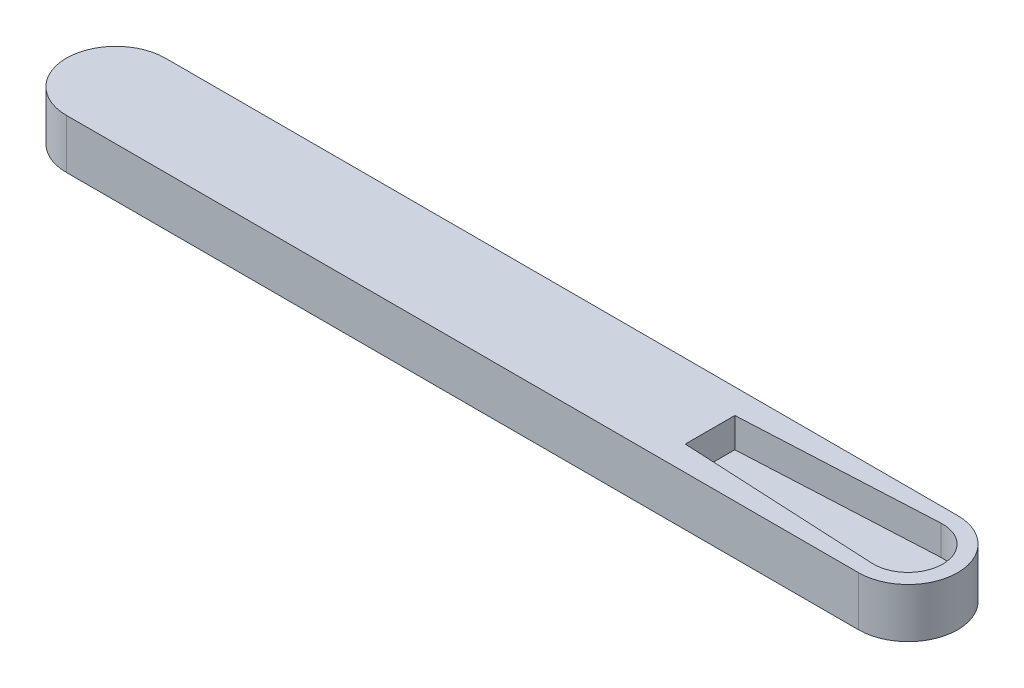
ISO-10303-21;
HEADER;
FILE_DESCRIPTION(('STEP AP214'),'2;1');
FILE_NAME('part.step','',(''),(''),'','','');
FILE_SCHEMA(('AUTOMOTIVE_DESIGN { 1 0 10303 214 1 1 1 1 }'));
ENDSEC;
DATA;
#1=APPLICATION_CONTEXT('core data for automotive mechanical design processes');
#2=APPLICATION_PROTOCOL_DEFINITION('international standard','automotive_design',2000,#1);
#3=PRODUCT_CONTEXT('',#1,'mechanical');
#4=PRODUCT('Part','Part','',(#3));
#5=PRODUCT_RELATED_PRODUCT_CATEGORY('part','',(#4));
#6=PRODUCT_DEFINITION_FORMATION('','',#4);
#7=PRODUCT_DEFINITION_CONTEXT('part definition',#1,'design');
#8=PRODUCT_DEFINITION('design','',#6,#7);
#9=PRODUCT_DEFINITION_SHAPE('','',#8);
#10=(LENGTH_UNIT() NAMED_UNIT(*) SI_UNIT(.MILLI.,.METRE.));
#11=(NAMED_UNIT(*) PLANE_ANGLE_UNIT() SI_UNIT($,.RADIAN.));
#12=(NAMED_UNIT(*) SI_UNIT($,.STERADIAN.) SOLID_ANGLE_UNIT());
#13=UNCERTAINTY_MEASURE_WITH_UNIT(LENGTH_MEASURE(1.E-05),#10,'distance_accuracy_value','');
#14=(GEOMETRIC_REPRESENTATION_CONTEXT(3) GLOBAL_UNCERTAINTY_ASSIGNED_CONTEXT((#13)) GLOBAL_UNIT_ASSIGNED_CONTEXT((#10,
#11,#12)) REPRESENTATION_CONTEXT('',''));
#15=CARTESIAN_POINT('',(0.,0.,0.));
#16=DIRECTION('',(0.,0.,1.));
#17=DIRECTION('',(1.,0.,0.));
#18=AXIS2_PLACEMENT_3D('',#15,#16,#17);
#19=CARTESIAN_POINT('',(0.,5.,5.));
#20=DIRECTION('',(0.,0.,-1.));
#21=DIRECTION('',(-1.,0.,0.));
#22=AXIS2_PLACEMENT_3D('',#19,#20,#21);
#23=PLANE('',#22);
#24=DIRECTION('',(1.,0.,0.));
#25=VECTOR('',#24,1.);
#26=CARTESIAN_POINT('',(0.,0.,5.));
#27=LINE('',#26,#25);
#28=CARTESIAN_POINT('',(0.,0.,5.));
#29=VERTEX_POINT('',#28);
#30=CARTESIAN_POINT('',(80.,0.,5.));
#31=VERTEX_POINT('',#30);
#32=EDGE_CURVE('E125',#29,#31,#27,.T.);
#33=ORIENTED_EDGE('',*,*,#32,.T.);
#34=DIRECTION('',(0.,-1.,0.));
#35=VECTOR('',#34,1.);
#36=CARTESIAN_POINT('',(80.,5.,5.));
#37=LINE('',#36,#35);
#38=CARTESIAN_POINT('',(80.,5.,5.));
#39=VERTEX_POINT('',#38);
#40=EDGE_CURVE('E11',#39,#31,#37,.T.);
#41=ORIENTED_EDGE('',*,*,#40,.F.);
#42=DIRECTION('',(1.,0.,0.));
#43=VECTOR('',#42,1.);
#44=CARTESIAN_POINT('',(0.,5.,5.));
#45=LINE('',#44,#43);
#46=CARTESIAN_POINT('',(0.,5.,5.));
#47=VERTEX_POINT('',#46);
#48=EDGE_CURVE('E136',#47,#39,#45,.T.);
#49=ORIENTED_EDGE('',*,*,#48,.F.);
#50=DIRECTION('',(0.,-1.,0.));
#51=VECTOR('',#50,1.);
#52=CARTESIAN_POINT('',(0.,5.,5.));
#53=LINE('',#52,#51);
#54=EDGE_CURVE('E155',#47,#29,#53,.T.);
#55=ORIENTED_EDGE('',*,*,#54,.T.);
#56=EDGE_LOOP('',(#33,#41,#49,#55));
#57=FACE_BOUND('',#56,.T.);
#58=ADVANCED_FACE('F35',(#57),#23,.F.);
#59=CARTESIAN_POINT('',(80.,5.,0.));
#60=DIRECTION('',(0.,-1.,0.));
#61=DIRECTION('',(0.,0.,-1.));
#62=AXIS2_PLACEMENT_3D('',#59,#60,#61);
#63=CYLINDRICAL_SURFACE('',#62,5.);
#64=CARTESIAN_POINT('',(80.,0.,0.));
#65=DIRECTION('',(0.,1.,0.));
#66=DIRECTION('',(0.,0.,1.));
#67=AXIS2_PLACEMENT_3D('',#64,#65,#66);
#68=CIRCLE('',#67,5.);
#69=CARTESIAN_POINT('',(80.,0.,-5.));
#70=VERTEX_POINT('',#69);
#71=EDGE_CURVE('E148',#31,#70,#68,.T.);
#72=ORIENTED_EDGE('',*,*,#71,.T.);
#73=DIRECTION('',(0.,-1.,0.));
#74=VECTOR('',#73,1.);
#75=CARTESIAN_POINT('',(80.,5.,-5.));
#76=LINE('',#75,#74);
#77=CARTESIAN_POINT('',(80.,5.,-5.));
#78=VERTEX_POINT('',#77);
#79=EDGE_CURVE('E44',#78,#70,#76,.T.);
#80=ORIENTED_EDGE('',*,*,#79,.F.);
#81=CARTESIAN_POINT('',(80.,5.,0.));
#82=DIRECTION('',(0.,1.,0.));
#83=DIRECTION('',(0.,0.,1.));
#84=AXIS2_PLACEMENT_3D('',#81,#82,#83);
#85=CIRCLE('',#84,5.);
#86=EDGE_CURVE('E139',#39,#78,#85,.T.);
#87=ORIENTED_EDGE('',*,*,#86,.F.);
#88=ORIENTED_EDGE('',*,*,#40,.T.);
#89=EDGE_LOOP('',(#72,#80,#87,#88));
#90=FACE_BOUND('',#89,.T.);
#91=ADVANCED_FACE('F180',(#90),#63,.T.);
#92=CARTESIAN_POINT('',(0.,5.,-5.));
#93=DIRECTION('',(0.,0.,-1.));
#94=DIRECTION('',(-1.,0.,0.));
#95=AXIS2_PLACEMENT_3D('',#92,#93,#94);
#96=PLANE('',#95);
#97=DIRECTION('',(1.,0.,0.));
#98=VECTOR('',#97,1.);
#99=CARTESIAN_POINT('',(0.,0.,-5.));
#100=LINE('',#99,#98);
#101=CARTESIAN_POINT('',(0.,0.,-5.));
#102=VERTEX_POINT('',#101);
#103=EDGE_CURVE('E151',#102,#70,#100,.T.);
#104=ORIENTED_EDGE('',*,*,#103,.F.);
#105=DIRECTION('',(0.,-1.,0.));
#106=VECTOR('',#105,1.);
#107=CARTESIAN_POINT('',(0.,5.,-5.));
#108=LINE('',#107,#106);
#109=CARTESIAN_POINT('',(0.,5.,-5.));
#110=VERTEX_POINT('',#109);
#111=EDGE_CURVE('E158',#110,#102,#108,.T.);
#112=ORIENTED_EDGE('',*,*,#111,.F.);
#113=DIRECTION('',(1.,0.,0.));
#114=VECTOR('',#113,1.);
#115=CARTESIAN_POINT('',(0.,5.,-5.));
#116=LINE('',#115,#114);
#117=EDGE_CURVE('E141',#110,#78,#116,.T.);
#118=ORIENTED_EDGE('',*,*,#117,.T.);
#119=ORIENTED_EDGE('',*,*,#79,.T.);
#120=EDGE_LOOP('',(#104,#112,#118,#119));
#121=FACE_BOUND('',#120,.T.);
#122=ADVANCED_FACE('F183',(#121),#96,.T.);
#123=CARTESIAN_POINT('',(60.,5.,0.));
#124=DIRECTION('',(1.,0.,0.));
#125=DIRECTION('',(0.,0.,-1.));
#126=AXIS2_PLACEMENT_3D('',#123,#124,#125);
#127=PLANE('',#126);
#128=DIRECTION('',(0.,0.,1.));
#129=VECTOR('',#128,1.);
#130=CARTESIAN_POINT('',(60.,2.,0.));
#131=LINE('',#130,#129);
#132=CARTESIAN_POINT('',(60.,2.,-2.5));
#133=VERTEX_POINT('',#132);
#134=CARTESIAN_POINT('',(60.,2.,2.5));
#135=VERTEX_POINT('',#134);
#136=EDGE_CURVE('E52',#133,#135,#131,.T.);
#137=ORIENTED_EDGE('',*,*,#136,.F.);
#138=DIRECTION('',(0.,-1.,0.));
#139=VECTOR('',#138,1.);
#140=CARTESIAN_POINT('',(60.,5.,-2.5));
#141=LINE('',#140,#139);
#142=CARTESIAN_POINT('',(60.,5.,-2.5));
#143=VERTEX_POINT('',#142);
#144=EDGE_CURVE('E39',#143,#133,#141,.T.);
#145=ORIENTED_EDGE('',*,*,#144,.F.);
#146=DIRECTION('',(0.,0.,1.));
#147=VECTOR('',#146,1.);
#148=CARTESIAN_POINT('',(60.,5.,0.));
#149=LINE('',#148,#147);
#150=CARTESIAN_POINT('',(60.,5.,2.5));
#151=VERTEX_POINT('',#150);
#152=EDGE_CURVE('E126',#143,#151,#149,.T.);
#153=ORIENTED_EDGE('',*,*,#152,.T.);
#154=DIRECTION('',(0.,-1.,0.));
#155=VECTOR('',#154,1.);
#156=CARTESIAN_POINT('',(60.,5.,2.5));
#157=LINE('',#156,#155);
#158=EDGE_CURVE('E113',#151,#135,#157,.T.);
#159=ORIENTED_EDGE('',*,*,#158,.T.);
#160=EDGE_LOOP('',(#137,#145,#153,#159));
#161=FACE_BOUND('',#160,.T.);
#162=ADVANCED_FACE('F37',(#161),#127,.T.);
#163=CARTESIAN_POINT('',(0.0257099828656738,5.,0.511941533854479));
#164=DIRECTION('',(0.0501573338998203,0.,0.998741328801438));
#165=DIRECTION('',(0.998741328801438,0.,-0.0501573338998203));
#166=AXIS2_PLACEMENT_3D('',#163,#164,#165);
#167=PLANE('',#166);
#168=DIRECTION('',(-0.998741328801438,0.,0.0501573338998203));
#169=VECTOR('',#168,1.);
#170=CARTESIAN_POINT('',(0.0257099828656738,2.,0.511941533854479));
#171=LINE('',#170,#169);
#172=CARTESIAN_POINT('',(79.8244493313506,2.,-3.49559465080503));
#173=VERTEX_POINT('',#172);
#174=EDGE_CURVE('E59',#173,#133,#171,.T.);
#175=ORIENTED_EDGE('',*,*,#174,.F.);
#176=DIRECTION('',(0.,-1.,0.));
#177=VECTOR('',#176,1.);
#178=CARTESIAN_POINT('',(79.8244493313506,5.,-3.49559465080503));
#179=LINE('',#178,#177);
#180=CARTESIAN_POINT('',(79.8244493313506,5.,-3.49559465080503));
#181=VERTEX_POINT('',#180);
#182=EDGE_CURVE('E112',#181,#173,#179,.T.);
#183=ORIENTED_EDGE('',*,*,#182,.F.);
#184=DIRECTION('',(-0.998741328801438,0.,0.0501573338998203));
#185=VECTOR('',#184,1.);
#186=CARTESIAN_POINT('',(0.0257099828656738,5.,0.511941533854479));
#187=LINE('',#186,#185);
#188=EDGE_CURVE('E129',#181,#143,#187,.T.);
#189=ORIENTED_EDGE('',*,*,#188,.T.);
#190=ORIENTED_EDGE('',*,*,#144,.T.);
#191=EDGE_LOOP('',(#175,#183,#189,#190));
#192=FACE_BOUND('',#191,.T.);
#193=ADVANCED_FACE('F161',(#192),#167,.T.);
#194=CARTESIAN_POINT('',(80.,5.,0.));
#195=DIRECTION('',(0.,-1.,0.));
#196=DIRECTION('',(0.,0.,-1.));
#197=AXIS2_PLACEMENT_3D('',#194,#195,#196);
#198=CYLINDRICAL_SURFACE('',#197,3.5);
#199=CARTESIAN_POINT('',(80.,2.,0.));
#200=DIRECTION('',(0.,1.,0.));
#201=DIRECTION('',(0.,0.,1.));
#202=AXIS2_PLACEMENT_3D('',#199,#200,#201);
#203=CIRCLE('',#202,3.5);
#204=CARTESIAN_POINT('',(79.8244493313506,2.,3.49559465080503));
#205=VERTEX_POINT('',#204);
#206=EDGE_CURVE('E116',#205,#173,#203,.T.);
#207=ORIENTED_EDGE('',*,*,#206,.F.);
#208=DIRECTION('',(0.,-1.,0.));
#209=VECTOR('',#208,1.);
#210=CARTESIAN_POINT('',(79.8244493313506,5.,3.49559465080503));
#211=LINE('',#210,#209);
#212=CARTESIAN_POINT('',(79.8244493313506,5.,3.49559465080503));
#213=VERTEX_POINT('',#212);
#214=EDGE_CURVE('E102',#213,#205,#211,.T.);
#215=ORIENTED_EDGE('',*,*,#214,.F.);
#216=CARTESIAN_POINT('',(80.,5.,0.));
#217=DIRECTION('',(0.,1.,0.));
#218=DIRECTION('',(0.,0.,1.));
#219=AXIS2_PLACEMENT_3D('',#216,#217,#218);
#220=CIRCLE('',#219,3.5);
#221=EDGE_CURVE('E133',#213,#181,#220,.T.);
#222=ORIENTED_EDGE('',*,*,#221,.T.);
#223=ORIENTED_EDGE('',*,*,#182,.T.);
#224=EDGE_LOOP('',(#207,#215,#222,#223));
#225=FACE_BOUND('',#224,.T.);
#226=ADVANCED_FACE('F117',(#225),#198,.F.);
#227=CARTESIAN_POINT('',(0.0257099828656738,5.,-0.511941533854479));
#228=DIRECTION('',(0.0501573338998203,0.,-0.998741328801438));
#229=DIRECTION('',(-0.998741328801438,0.,-0.0501573338998203));
#230=AXIS2_PLACEMENT_3D('',#227,#228,#229);
#231=PLANE('',#230);
#232=DIRECTION('',(0.998741328801438,0.,0.0501573338998203));
#233=VECTOR('',#232,1.);
#234=CARTESIAN_POINT('',(0.0257099828656738,2.,-0.511941533854479));
#235=LINE('',#234,#233);
#236=EDGE_CURVE('E106',#135,#205,#235,.T.);
#237=ORIENTED_EDGE('',*,*,#236,.F.);
#238=ORIENTED_EDGE('',*,*,#158,.F.);
#239=DIRECTION('',(0.998741328801438,0.,0.0501573338998203));
#240=VECTOR('',#239,1.);
#241=CARTESIAN_POINT('',(0.0257099828656738,5.,-0.511941533854479));
#242=LINE('',#241,#240);
#243=EDGE_CURVE('E108',#151,#213,#242,.T.);
#244=ORIENTED_EDGE('',*,*,#243,.T.);
#245=ORIENTED_EDGE('',*,*,#214,.T.);
#246=EDGE_LOOP('',(#237,#238,#244,#245));
#247=FACE_BOUND('',#246,.T.);
#248=ADVANCED_FACE('F104',(#247),#231,.T.);
#249=CARTESIAN_POINT('',(0.,5.,0.));
#250=DIRECTION('',(0.,-1.,0.));
#251=DIRECTION('',(0.,0.,-1.));
#252=AXIS2_PLACEMENT_3D('',#249,#250,#251);
#253=CYLINDRICAL_SURFACE('',#252,5.);
#254=CARTESIAN_POINT('',(0.,0.,0.));
#255=DIRECTION('',(0.,1.,0.));
#256=DIRECTION('',(0.,0.,1.));
#257=AXIS2_PLACEMENT_3D('',#254,#255,#256);
#258=CIRCLE('',#257,5.);
#259=EDGE_CURVE('E130',#102,#29,#258,.T.);
#260=ORIENTED_EDGE('',*,*,#259,.T.);
#261=ORIENTED_EDGE('',*,*,#54,.F.);
#262=CARTESIAN_POINT('',(0.,5.,0.));
#263=DIRECTION('',(0.,1.,0.));
#264=DIRECTION('',(0.,0.,1.));
#265=AXIS2_PLACEMENT_3D('',#262,#263,#264);
#266=CIRCLE('',#265,5.);
#267=EDGE_CURVE('E144',#110,#47,#266,.T.);
#268=ORIENTED_EDGE('',*,*,#267,.F.);
#269=ORIENTED_EDGE('',*,*,#111,.T.);
#270=EDGE_LOOP('',(#260,#261,#268,#269));
#271=FACE_BOUND('',#270,.T.);
#272=ADVANCED_FACE('F169',(#271),#253,.T.);
#273=CARTESIAN_POINT('',(0.,5.,0.));
#274=DIRECTION('',(0.,1.,0.));
#275=DIRECTION('',(0.,0.,1.));
#276=AXIS2_PLACEMENT_3D('',#273,#274,#275);
#277=PLANE('',#276);
#278=ORIENTED_EDGE('',*,*,#152,.F.);
#279=ORIENTED_EDGE('',*,*,#188,.F.);
#280=ORIENTED_EDGE('',*,*,#221,.F.);
#281=ORIENTED_EDGE('',*,*,#243,.F.);
#282=EDGE_LOOP('',(#278,#279,#280,#281));
#283=FACE_BOUND('',#282,.T.);
#284=ORIENTED_EDGE('',*,*,#48,.T.);
#285=ORIENTED_EDGE('',*,*,#86,.T.);
#286=ORIENTED_EDGE('',*,*,#117,.F.);
#287=ORIENTED_EDGE('',*,*,#267,.T.);
#288=EDGE_LOOP('',(#284,#285,#286,#287));
#289=FACE_BOUND('',#288,.T.);
#290=ADVANCED_FACE('F165',(#283,#289),#277,.T.);
#291=CARTESIAN_POINT('',(0.,0.,0.));
#292=DIRECTION('',(0.,1.,0.));
#293=DIRECTION('',(0.,0.,1.));
#294=AXIS2_PLACEMENT_3D('',#291,#292,#293);
#295=PLANE('',#294);
#296=ORIENTED_EDGE('',*,*,#32,.F.);
#297=ORIENTED_EDGE('',*,*,#259,.F.);
#298=ORIENTED_EDGE('',*,*,#103,.T.);
#299=ORIENTED_EDGE('',*,*,#71,.F.);
#300=EDGE_LOOP('',(#296,#297,#298,#299));
#301=FACE_BOUND('',#300,.T.);
#302=ADVANCED_FACE('F168',(#301),#295,.F.);
#303=CARTESIAN_POINT('',(0.,2.,0.));
#304=DIRECTION('',(0.,1.,0.));
#305=DIRECTION('',(0.,0.,1.));
#306=AXIS2_PLACEMENT_3D('',#303,#304,#305);
#307=PLANE('',#306);
#308=ORIENTED_EDGE('',*,*,#236,.T.);
#309=ORIENTED_EDGE('',*,*,#206,.T.);
#310=ORIENTED_EDGE('',*,*,#174,.T.);
#311=ORIENTED_EDGE('',*,*,#136,.T.);
#312=EDGE_LOOP('',(#308,#309,#310,#311));
#313=FACE_BOUND('',#312,.T.);
#314=ADVANCED_FACE('F120',(#313),#307,.T.);
#315=CLOSED_SHELL('',(#58,#91,#122,#162,#193,#226,#248,#272,#290,#302,#314));
#316=MANIFOLD_SOLID_BREP('B2',#315);
#317=ADVANCED_BREP_SHAPE_REPRESENTATION('',(#18,#316),#14);
#318=SHAPE_DEFINITION_REPRESENTATION(#9,#317);
ENDSEC;
END-ISO-10303-21;
